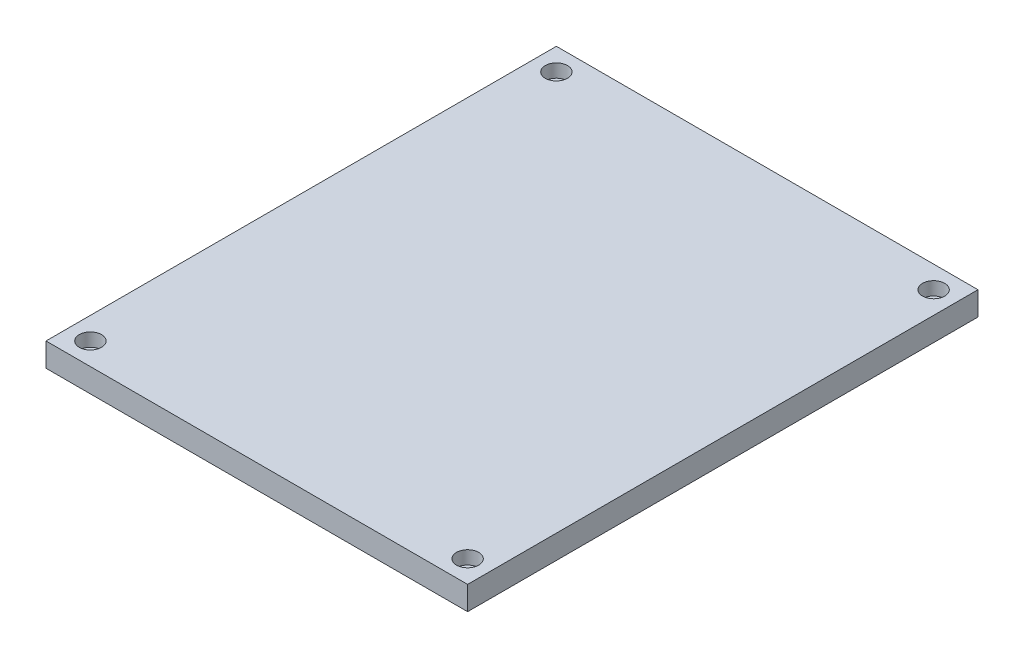
ISO-10303-21;
HEADER;
FILE_DESCRIPTION(('STEP AP214'),'2;1');
FILE_NAME('part.step','',(''),(''),'','','');
FILE_SCHEMA(('AUTOMOTIVE_DESIGN { 1 0 10303 214 1 1 1 1 }'));
ENDSEC;
DATA;
#1=APPLICATION_CONTEXT('core data for automotive mechanical design processes');
#2=APPLICATION_PROTOCOL_DEFINITION('international standard','automotive_design',2000,#1);
#3=PRODUCT_CONTEXT('',#1,'mechanical');
#4=PRODUCT('Part','Part','',(#3));
#5=PRODUCT_RELATED_PRODUCT_CATEGORY('part','',(#4));
#6=PRODUCT_DEFINITION_FORMATION('','',#4);
#7=PRODUCT_DEFINITION_CONTEXT('part definition',#1,'design');
#8=PRODUCT_DEFINITION('design','',#6,#7);
#9=PRODUCT_DEFINITION_SHAPE('','',#8);
#10=(LENGTH_UNIT() NAMED_UNIT(*) SI_UNIT(.MILLI.,.METRE.));
#11=(NAMED_UNIT(*) PLANE_ANGLE_UNIT() SI_UNIT($,.RADIAN.));
#12=(NAMED_UNIT(*) SI_UNIT($,.STERADIAN.) SOLID_ANGLE_UNIT());
#13=UNCERTAINTY_MEASURE_WITH_UNIT(LENGTH_MEASURE(1.E-05),#10,'distance_accuracy_value','');
#14=(GEOMETRIC_REPRESENTATION_CONTEXT(3) GLOBAL_UNCERTAINTY_ASSIGNED_CONTEXT((#13)) GLOBAL_UNIT_ASSIGNED_CONTEXT((#10,
#11,#12)) REPRESENTATION_CONTEXT('',''));
#15=CARTESIAN_POINT('',(0.,0.,0.));
#16=DIRECTION('',(0.,0.,1.));
#17=DIRECTION('',(1.,0.,0.));
#18=AXIS2_PLACEMENT_3D('',#15,#16,#17);
#19=CARTESIAN_POINT('',(7.50000000000001,-4.,-165.));
#20=DIRECTION('',(0.,1.,0.));
#21=DIRECTION('',(0.,0.,1.));
#22=AXIS2_PLACEMENT_3D('',#19,#20,#21);
#23=CYLINDRICAL_SURFACE('',#22,2.25000000000001);
#24=CARTESIAN_POINT('',(7.50000000000001,-4.,-165.));
#25=DIRECTION('',(0.,1.,0.));
#26=DIRECTION('',(0.,0.,1.));
#27=AXIS2_PLACEMENT_3D('',#24,#25,#26);
#28=CIRCLE('',#27,2.25000000000001);
#29=CARTESIAN_POINT('',(7.50000000000001,-4.,-162.75));
#30=VERTEX_POINT('',#29);
#31=EDGE_CURVE('E106',#30,#30,#28,.T.);
#32=ORIENTED_EDGE('',*,*,#31,.F.);
#33=EDGE_LOOP('',(#32));
#34=FACE_BOUND('',#33,.T.);
#35=CARTESIAN_POINT('',(7.50000000000001,-0.5,-165.));
#36=DIRECTION('',(0.,1.,0.));
#37=DIRECTION('',(0.,0.,1.));
#38=AXIS2_PLACEMENT_3D('',#35,#36,#37);
#39=CIRCLE('',#38,2.25000000000001);
#40=CARTESIAN_POINT('',(7.50000000000001,-0.5,-162.75));
#41=VERTEX_POINT('',#40);
#42=EDGE_CURVE('E122',#41,#41,#39,.F.);
#43=ORIENTED_EDGE('',*,*,#42,.F.);
#44=EDGE_LOOP('',(#43));
#45=FACE_BOUND('',#44,.T.);
#46=ADVANCED_FACE('F36',(#34,#45),#23,.F.);
#47=CARTESIAN_POINT('',(135.,-4.,-165.));
#48=DIRECTION('',(0.,1.,0.));
#49=DIRECTION('',(0.,0.,1.));
#50=AXIS2_PLACEMENT_3D('',#47,#48,#49);
#51=CYLINDRICAL_SURFACE('',#50,2.25000000000001);
#52=CARTESIAN_POINT('',(135.,-4.,-165.));
#53=DIRECTION('',(0.,1.,0.));
#54=DIRECTION('',(0.,0.,1.));
#55=AXIS2_PLACEMENT_3D('',#52,#53,#54);
#56=CIRCLE('',#55,2.25000000000001);
#57=CARTESIAN_POINT('',(135.,-4.,-162.75));
#58=VERTEX_POINT('',#57);
#59=EDGE_CURVE('E144',#58,#58,#56,.T.);
#60=ORIENTED_EDGE('',*,*,#59,.F.);
#61=EDGE_LOOP('',(#60));
#62=FACE_BOUND('',#61,.T.);
#63=CARTESIAN_POINT('',(135.,-0.5,-165.));
#64=DIRECTION('',(0.,1.,0.));
#65=DIRECTION('',(0.,0.,1.));
#66=AXIS2_PLACEMENT_3D('',#63,#64,#65);
#67=CIRCLE('',#66,2.25000000000001);
#68=CARTESIAN_POINT('',(135.,-0.5,-162.75));
#69=VERTEX_POINT('',#68);
#70=EDGE_CURVE('E119',#69,#69,#67,.F.);
#71=ORIENTED_EDGE('',*,*,#70,.F.);
#72=EDGE_LOOP('',(#71));
#73=FACE_BOUND('',#72,.T.);
#74=ADVANCED_FACE('F200',(#62,#73),#51,.F.);
#75=CARTESIAN_POINT('',(135.,-4.,-7.5));
#76=DIRECTION('',(0.,1.,0.));
#77=DIRECTION('',(0.,0.,1.));
#78=AXIS2_PLACEMENT_3D('',#75,#76,#77);
#79=CYLINDRICAL_SURFACE('',#78,2.25000000000001);
#80=CARTESIAN_POINT('',(135.,-4.,-7.5));
#81=DIRECTION('',(0.,1.,0.));
#82=DIRECTION('',(0.,0.,1.));
#83=AXIS2_PLACEMENT_3D('',#80,#81,#82);
#84=CIRCLE('',#83,2.25000000000001);
#85=CARTESIAN_POINT('',(135.,-4.,-5.24999999999999));
#86=VERTEX_POINT('',#85);
#87=EDGE_CURVE('E139',#86,#86,#84,.T.);
#88=ORIENTED_EDGE('',*,*,#87,.F.);
#89=EDGE_LOOP('',(#88));
#90=FACE_BOUND('',#89,.T.);
#91=CARTESIAN_POINT('',(135.,-0.5,-7.5));
#92=DIRECTION('',(0.,1.,0.));
#93=DIRECTION('',(0.,0.,1.));
#94=AXIS2_PLACEMENT_3D('',#91,#92,#93);
#95=CIRCLE('',#94,2.25000000000001);
#96=CARTESIAN_POINT('',(135.,-0.5,-5.24999999999999));
#97=VERTEX_POINT('',#96);
#98=EDGE_CURVE('E115',#97,#97,#95,.F.);
#99=ORIENTED_EDGE('',*,*,#98,.F.);
#100=EDGE_LOOP('',(#99));
#101=FACE_BOUND('',#100,.T.);
#102=ADVANCED_FACE('F206',(#90,#101),#79,.F.);
#103=CARTESIAN_POINT('',(7.50000000000001,-4.,-7.5));
#104=DIRECTION('',(0.,1.,0.));
#105=DIRECTION('',(0.,0.,1.));
#106=AXIS2_PLACEMENT_3D('',#103,#104,#105);
#107=CYLINDRICAL_SURFACE('',#106,2.25);
#108=CARTESIAN_POINT('',(7.50000000000001,-4.,-7.5));
#109=DIRECTION('',(0.,1.,0.));
#110=DIRECTION('',(0.,0.,1.));
#111=AXIS2_PLACEMENT_3D('',#108,#109,#110);
#112=CIRCLE('',#111,2.25);
#113=CARTESIAN_POINT('',(7.50000000000001,-4.,-5.25));
#114=VERTEX_POINT('',#113);
#115=EDGE_CURVE('E135',#114,#114,#112,.T.);
#116=ORIENTED_EDGE('',*,*,#115,.F.);
#117=EDGE_LOOP('',(#116));
#118=FACE_BOUND('',#117,.T.);
#119=CARTESIAN_POINT('',(7.50000000000001,-0.5,-7.5));
#120=DIRECTION('',(0.,1.,0.));
#121=DIRECTION('',(0.,0.,1.));
#122=AXIS2_PLACEMENT_3D('',#119,#120,#121);
#123=CIRCLE('',#122,2.25);
#124=CARTESIAN_POINT('',(7.50000000000001,-0.5,-5.25));
#125=VERTEX_POINT('',#124);
#126=EDGE_CURVE('E112',#125,#125,#123,.F.);
#127=ORIENTED_EDGE('',*,*,#126,.F.);
#128=EDGE_LOOP('',(#127));
#129=FACE_BOUND('',#128,.T.);
#130=ADVANCED_FACE('F210',(#118,#129),#107,.F.);
#131=CARTESIAN_POINT('',(142.5,4.,0.));
#132=DIRECTION('',(0.,0.,-1.));
#133=DIRECTION('',(-1.,0.,0.));
#134=AXIS2_PLACEMENT_3D('',#131,#132,#133);
#135=PLANE('',#134);
#136=DIRECTION('',(1.,0.,0.));
#137=VECTOR('',#136,1.);
#138=CARTESIAN_POINT('',(142.5,-4.,0.));
#139=LINE('',#138,#137);
#140=CARTESIAN_POINT('',(0.,-4.,0.));
#141=VERTEX_POINT('',#140);
#142=CARTESIAN_POINT('',(142.5,-4.,0.));
#143=VERTEX_POINT('',#142);
#144=EDGE_CURVE('E103',#141,#143,#139,.T.);
#145=ORIENTED_EDGE('',*,*,#144,.T.);
#146=DIRECTION('',(0.,-1.,0.));
#147=VECTOR('',#146,1.);
#148=CARTESIAN_POINT('',(142.5,4.,0.));
#149=LINE('',#148,#147);
#150=CARTESIAN_POINT('',(142.5,4.,0.));
#151=VERTEX_POINT('',#150);
#152=EDGE_CURVE('E11',#151,#143,#149,.T.);
#153=ORIENTED_EDGE('',*,*,#152,.F.);
#154=DIRECTION('',(1.,0.,0.));
#155=VECTOR('',#154,1.);
#156=CARTESIAN_POINT('',(142.5,4.,0.));
#157=LINE('',#156,#155);
#158=CARTESIAN_POINT('',(0.,4.,0.));
#159=VERTEX_POINT('',#158);
#160=EDGE_CURVE('E90',#159,#151,#157,.T.);
#161=ORIENTED_EDGE('',*,*,#160,.F.);
#162=DIRECTION('',(0.,-1.,0.));
#163=VECTOR('',#162,1.);
#164=CARTESIAN_POINT('',(0.,4.,0.));
#165=LINE('',#164,#163);
#166=EDGE_CURVE('E99',#159,#141,#165,.T.);
#167=ORIENTED_EDGE('',*,*,#166,.T.);
#168=EDGE_LOOP('',(#145,#153,#161,#167));
#169=FACE_BOUND('',#168,.T.);
#170=ADVANCED_FACE('F38',(#169),#135,.F.);
#171=CARTESIAN_POINT('',(142.5,4.,-172.5));
#172=DIRECTION('',(-1.,0.,0.));
#173=DIRECTION('',(0.,0.,1.));
#174=AXIS2_PLACEMENT_3D('',#171,#172,#173);
#175=PLANE('',#174);
#176=DIRECTION('',(0.,0.,-1.));
#177=VECTOR('',#176,1.);
#178=CARTESIAN_POINT('',(142.5,-4.,-172.5));
#179=LINE('',#178,#177);
#180=CARTESIAN_POINT('',(142.5,-4.,-172.5));
#181=VERTEX_POINT('',#180);
#182=EDGE_CURVE('E94',#143,#181,#179,.T.);
#183=ORIENTED_EDGE('',*,*,#182,.T.);
#184=DIRECTION('',(0.,-1.,0.));
#185=VECTOR('',#184,1.);
#186=CARTESIAN_POINT('',(142.5,4.,-172.5));
#187=LINE('',#186,#185);
#188=CARTESIAN_POINT('',(142.5,4.,-172.5));
#189=VERTEX_POINT('',#188);
#190=EDGE_CURVE('E46',#189,#181,#187,.T.);
#191=ORIENTED_EDGE('',*,*,#190,.F.);
#192=DIRECTION('',(0.,0.,-1.));
#193=VECTOR('',#192,1.);
#194=CARTESIAN_POINT('',(142.5,4.,-172.5));
#195=LINE('',#194,#193);
#196=EDGE_CURVE('E85',#151,#189,#195,.T.);
#197=ORIENTED_EDGE('',*,*,#196,.F.);
#198=ORIENTED_EDGE('',*,*,#152,.T.);
#199=EDGE_LOOP('',(#183,#191,#197,#198));
#200=FACE_BOUND('',#199,.T.);
#201=ADVANCED_FACE('F93',(#200),#175,.F.);
#202=CARTESIAN_POINT('',(0.,4.,-172.5));
#203=DIRECTION('',(0.,0.,1.));
#204=DIRECTION('',(1.,0.,0.));
#205=AXIS2_PLACEMENT_3D('',#202,#203,#204);
#206=PLANE('',#205);
#207=DIRECTION('',(-1.,0.,0.));
#208=VECTOR('',#207,1.);
#209=CARTESIAN_POINT('',(0.,-4.,-172.5));
#210=LINE('',#209,#208);
#211=CARTESIAN_POINT('',(0.,-4.,-172.5));
#212=VERTEX_POINT('',#211);
#213=EDGE_CURVE('E72',#181,#212,#210,.T.);
#214=ORIENTED_EDGE('',*,*,#213,.T.);
#215=DIRECTION('',(0.,-1.,0.));
#216=VECTOR('',#215,1.);
#217=CARTESIAN_POINT('',(0.,4.,-172.5));
#218=LINE('',#217,#216);
#219=CARTESIAN_POINT('',(0.,4.,-172.5));
#220=VERTEX_POINT('',#219);
#221=EDGE_CURVE('E95',#220,#212,#218,.T.);
#222=ORIENTED_EDGE('',*,*,#221,.F.);
#223=DIRECTION('',(-1.,0.,0.));
#224=VECTOR('',#223,1.);
#225=CARTESIAN_POINT('',(0.,4.,-172.5));
#226=LINE('',#225,#224);
#227=EDGE_CURVE('E88',#189,#220,#226,.T.);
#228=ORIENTED_EDGE('',*,*,#227,.F.);
#229=ORIENTED_EDGE('',*,*,#190,.T.);
#230=EDGE_LOOP('',(#214,#222,#228,#229));
#231=FACE_BOUND('',#230,.T.);
#232=ADVANCED_FACE('F97',(#231),#206,.F.);
#233=CARTESIAN_POINT('',(0.,4.,0.));
#234=DIRECTION('',(1.,0.,0.));
#235=DIRECTION('',(0.,0.,-1.));
#236=AXIS2_PLACEMENT_3D('',#233,#234,#235);
#237=PLANE('',#236);
#238=DIRECTION('',(0.,0.,1.));
#239=VECTOR('',#238,1.);
#240=CARTESIAN_POINT('',(0.,-4.,0.));
#241=LINE('',#240,#239);
#242=EDGE_CURVE('E78',#212,#141,#241,.T.);
#243=ORIENTED_EDGE('',*,*,#242,.T.);
#244=ORIENTED_EDGE('',*,*,#166,.F.);
#245=DIRECTION('',(0.,0.,1.));
#246=VECTOR('',#245,1.);
#247=CARTESIAN_POINT('',(0.,4.,0.));
#248=LINE('',#247,#246);
#249=EDGE_CURVE('E55',#220,#159,#248,.T.);
#250=ORIENTED_EDGE('',*,*,#249,.F.);
#251=ORIENTED_EDGE('',*,*,#221,.T.);
#252=EDGE_LOOP('',(#243,#244,#250,#251));
#253=FACE_BOUND('',#252,.T.);
#254=ADVANCED_FACE('F180',(#253),#237,.F.);
#255=CARTESIAN_POINT('',(0.,4.,0.));
#256=DIRECTION('',(0.,-1.,0.));
#257=DIRECTION('',(0.,0.,-1.));
#258=AXIS2_PLACEMENT_3D('',#255,#256,#257);
#259=PLANE('',#258);
#260=CARTESIAN_POINT('',(7.50000000000001,4.,-7.5));
#261=DIRECTION('',(0.,-1.,0.));
#262=DIRECTION('',(0.,0.,-1.));
#263=AXIS2_PLACEMENT_3D('',#260,#261,#262);
#264=CIRCLE('',#263,3.75);
#265=CARTESIAN_POINT('',(7.50000000000001,4.,-11.25));
#266=VERTEX_POINT('',#265);
#267=EDGE_CURVE('E40',#266,#266,#264,.F.);
#268=ORIENTED_EDGE('',*,*,#267,.F.);
#269=EDGE_LOOP('',(#268));
#270=FACE_BOUND('',#269,.T.);
#271=CARTESIAN_POINT('',(135.,4.,-7.5));
#272=DIRECTION('',(0.,-1.,0.));
#273=DIRECTION('',(0.,0.,-1.));
#274=AXIS2_PLACEMENT_3D('',#271,#272,#273);
#275=CIRCLE('',#274,3.75000000000001);
#276=CARTESIAN_POINT('',(135.,4.,-11.25));
#277=VERTEX_POINT('',#276);
#278=EDGE_CURVE('E130',#277,#277,#275,.F.);
#279=ORIENTED_EDGE('',*,*,#278,.F.);
#280=EDGE_LOOP('',(#279));
#281=FACE_BOUND('',#280,.T.);
#282=CARTESIAN_POINT('',(135.,4.,-165.));
#283=DIRECTION('',(0.,-1.,0.));
#284=DIRECTION('',(0.,0.,-1.));
#285=AXIS2_PLACEMENT_3D('',#282,#283,#284);
#286=CIRCLE('',#285,3.75000000000001);
#287=CARTESIAN_POINT('',(135.,4.,-168.75));
#288=VERTEX_POINT('',#287);
#289=EDGE_CURVE('E128',#288,#288,#286,.F.);
#290=ORIENTED_EDGE('',*,*,#289,.F.);
#291=EDGE_LOOP('',(#290));
#292=FACE_BOUND('',#291,.T.);
#293=CARTESIAN_POINT('',(7.50000000000001,4.,-165.));
#294=DIRECTION('',(0.,-1.,0.));
#295=DIRECTION('',(0.,0.,-1.));
#296=AXIS2_PLACEMENT_3D('',#293,#294,#295);
#297=CIRCLE('',#296,3.75);
#298=CARTESIAN_POINT('',(7.50000000000001,4.,-168.75));
#299=VERTEX_POINT('',#298);
#300=EDGE_CURVE('E125',#299,#299,#297,.F.);
#301=ORIENTED_EDGE('',*,*,#300,.F.);
#302=EDGE_LOOP('',(#301));
#303=FACE_BOUND('',#302,.T.);
#304=ORIENTED_EDGE('',*,*,#160,.T.);
#305=ORIENTED_EDGE('',*,*,#196,.T.);
#306=ORIENTED_EDGE('',*,*,#227,.T.);
#307=ORIENTED_EDGE('',*,*,#249,.T.);
#308=EDGE_LOOP('',(#304,#305,#306,#307));
#309=FACE_BOUND('',#308,.T.);
#310=ADVANCED_FACE('F86',(#270,#281,#292,#303,#309),#259,.F.);
#311=CARTESIAN_POINT('',(0.,-4.,0.));
#312=DIRECTION('',(0.,-1.,0.));
#313=DIRECTION('',(0.,0.,-1.));
#314=AXIS2_PLACEMENT_3D('',#311,#312,#313);
#315=PLANE('',#314);
#316=ORIENTED_EDGE('',*,*,#115,.T.);
#317=EDGE_LOOP('',(#316));
#318=FACE_BOUND('',#317,.T.);
#319=ORIENTED_EDGE('',*,*,#87,.T.);
#320=EDGE_LOOP('',(#319));
#321=FACE_BOUND('',#320,.T.);
#322=ORIENTED_EDGE('',*,*,#59,.T.);
#323=EDGE_LOOP('',(#322));
#324=FACE_BOUND('',#323,.T.);
#325=ORIENTED_EDGE('',*,*,#31,.T.);
#326=EDGE_LOOP('',(#325));
#327=FACE_BOUND('',#326,.T.);
#328=ORIENTED_EDGE('',*,*,#144,.F.);
#329=ORIENTED_EDGE('',*,*,#242,.F.);
#330=ORIENTED_EDGE('',*,*,#213,.F.);
#331=ORIENTED_EDGE('',*,*,#182,.F.);
#332=EDGE_LOOP('',(#328,#329,#330,#331));
#333=FACE_BOUND('',#332,.T.);
#334=ADVANCED_FACE('F179',(#318,#321,#324,#327,#333),#315,.T.);
#335=CARTESIAN_POINT('',(7.50000000000001,4.000012,-7.5));
#336=DIRECTION('',(0.,-1.,0.));
#337=DIRECTION('',(0.,0.,-1.));
#338=AXIS2_PLACEMENT_3D('',#335,#336,#337);
#339=CYLINDRICAL_SURFACE('',#338,3.75);
#340=CARTESIAN_POINT('',(7.50000000000001,-0.5,-7.5));
#341=DIRECTION('',(0.,1.,0.));
#342=DIRECTION('',(0.,0.,1.));
#343=AXIS2_PLACEMENT_3D('',#340,#341,#342);
#344=CIRCLE('',#343,3.75);
#345=CARTESIAN_POINT('',(7.50000000000001,-0.5,-11.25));
#346=VERTEX_POINT('',#345);
#347=EDGE_CURVE('E158',#346,#346,#344,.T.);
#348=CARTESIAN_POINT('',(7.50000000000001,-0.5,-11.25));
#349=CARTESIAN_POINT('',(7.50000000000001,-0.453125,-11.25));
#350=CARTESIAN_POINT('',(7.50000000000001,-0.40625,-11.25));
#351=CARTESIAN_POINT('',(7.50000000000001,-0.3125,-11.25));
#352=CARTESIAN_POINT('',(7.50000000000001,-0.265625,-11.25));
#353=CARTESIAN_POINT('',(7.50000000000001,-0.171875,-11.25));
#354=CARTESIAN_POINT('',(7.50000000000001,-0.125,-11.25));
#355=CARTESIAN_POINT('',(7.50000000000001,-0.03125,-11.25));
#356=CARTESIAN_POINT('',(7.50000000000001,0.015625,-11.25));
#357=CARTESIAN_POINT('',(7.50000000000001,0.109375,-11.25));
#358=CARTESIAN_POINT('',(7.50000000000001,0.15625,-11.25));
#359=CARTESIAN_POINT('',(7.50000000000001,0.25,-11.25));
#360=CARTESIAN_POINT('',(7.50000000000001,0.296875,-11.25));
#361=CARTESIAN_POINT('',(7.50000000000001,0.390625,-11.25));
#362=CARTESIAN_POINT('',(7.50000000000001,0.4375,-11.25));
#363=CARTESIAN_POINT('',(7.50000000000001,0.53125,-11.25));
#364=CARTESIAN_POINT('',(7.50000000000001,0.578125,-11.25));
#365=CARTESIAN_POINT('',(7.50000000000001,0.671875,-11.25));
#366=CARTESIAN_POINT('',(7.50000000000001,0.71875,-11.25));
#367=CARTESIAN_POINT('',(7.50000000000001,0.8125,-11.25));
#368=CARTESIAN_POINT('',(7.50000000000001,0.859375,-11.25));
#369=CARTESIAN_POINT('',(7.50000000000001,0.953125,-11.25));
#370=CARTESIAN_POINT('',(7.50000000000001,1.,-11.25));
#371=CARTESIAN_POINT('',(7.50000000000001,1.09375,-11.25));
#372=CARTESIAN_POINT('',(7.50000000000001,1.140625,-11.25));
#373=CARTESIAN_POINT('',(7.50000000000001,1.234375,-11.25));
#374=CARTESIAN_POINT('',(7.50000000000001,1.28125,-11.25));
#375=CARTESIAN_POINT('',(7.50000000000001,1.375,-11.25));
#376=CARTESIAN_POINT('',(7.50000000000001,1.421875,-11.25));
#377=CARTESIAN_POINT('',(7.50000000000001,1.515625,-11.25));
#378=CARTESIAN_POINT('',(7.50000000000001,1.5625,-11.25));
#379=CARTESIAN_POINT('',(7.50000000000001,1.65625,-11.25));
#380=CARTESIAN_POINT('',(7.50000000000001,1.703125,-11.25));
#381=CARTESIAN_POINT('',(7.50000000000001,1.796875,-11.25));
#382=CARTESIAN_POINT('',(7.50000000000001,1.84375,-11.25));
#383=CARTESIAN_POINT('',(7.50000000000001,1.9375,-11.25));
#384=CARTESIAN_POINT('',(7.50000000000001,1.984375,-11.25));
#385=CARTESIAN_POINT('',(7.50000000000001,2.078125,-11.25));
#386=CARTESIAN_POINT('',(7.50000000000001,2.125,-11.25));
#387=CARTESIAN_POINT('',(7.50000000000001,2.21875,-11.25));
#388=CARTESIAN_POINT('',(7.50000000000001,2.265625,-11.25));
#389=CARTESIAN_POINT('',(7.50000000000001,2.359375,-11.25));
#390=CARTESIAN_POINT('',(7.50000000000001,2.40625,-11.25));
#391=CARTESIAN_POINT('',(7.50000000000001,2.5,-11.25));
#392=CARTESIAN_POINT('',(7.50000000000001,2.546875,-11.25));
#393=CARTESIAN_POINT('',(7.50000000000001,2.640625,-11.25));
#394=CARTESIAN_POINT('',(7.50000000000001,2.6875,-11.25));
#395=CARTESIAN_POINT('',(7.50000000000001,2.78125,-11.25));
#396=CARTESIAN_POINT('',(7.50000000000001,2.828125,-11.25));
#397=CARTESIAN_POINT('',(7.50000000000001,2.921875,-11.25));
#398=CARTESIAN_POINT('',(7.50000000000001,2.96875,-11.25));
#399=CARTESIAN_POINT('',(7.50000000000001,3.0625,-11.25));
#400=CARTESIAN_POINT('',(7.50000000000001,3.109375,-11.25));
#401=CARTESIAN_POINT('',(7.50000000000001,3.203125,-11.25));
#402=CARTESIAN_POINT('',(7.50000000000001,3.25,-11.25));
#403=CARTESIAN_POINT('',(7.50000000000001,3.34375,-11.25));
#404=CARTESIAN_POINT('',(7.50000000000001,3.390625,-11.25));
#405=CARTESIAN_POINT('',(7.50000000000001,3.484375,-11.25));
#406=CARTESIAN_POINT('',(7.50000000000001,3.53125,-11.25));
#407=CARTESIAN_POINT('',(7.50000000000001,3.625,-11.25));
#408=CARTESIAN_POINT('',(7.50000000000001,3.671875,-11.25));
#409=CARTESIAN_POINT('',(7.50000000000001,3.765625,-11.25));
#410=CARTESIAN_POINT('',(7.50000000000001,3.8125,-11.25));
#411=CARTESIAN_POINT('',(7.50000000000001,3.90625,-11.25));
#412=CARTESIAN_POINT('',(7.50000000000001,3.953125,-11.25));
#413=CARTESIAN_POINT('',(7.50000000000001,4.,-11.25));
#414=B_SPLINE_CURVE_WITH_KNOTS('',3,(#348,#349,#350,#351,#352,#353,#354,#355,#356,#357,#358,
#359,#360,#361,#362,#363,#364,#365,#366,#367,#368,#369,#370,#371,#372,#373,#374,#375,#376,#377,
#378,#379,#380,#381,#382,#383,#384,#385,#386,#387,#388,#389,#390,#391,#392,#393,#394,#395,#396,
#397,#398,#399,#400,#401,#402,#403,#404,#405,#406,#407,#408,#409,#410,#411,#412,#413),
.UNSPECIFIED.,.F.,.F.,(4,2,2,2,2,2,2,2,2,2,2,2,2,2,2,2,2,2,2,2,2,2,2,2,2,2,2,2,2,2,2,2,4),(0.,
0.140625,0.28125,0.421875,0.5625,0.703125,0.84375,0.984375,1.125,1.265625,1.40625,1.546875,
1.6875,1.828125,1.96875,2.109375,2.25,2.390625,2.53125,2.671875,2.8125,2.953125,3.09375,
3.234375,3.375,3.515625,3.65625,3.796875,3.9375,4.078125,4.21875,4.359375,4.5),.UNSPECIFIED.);
#415=EDGE_CURVE('BSEAM215',#346,#266,#414,.T.);
#416=ORIENTED_EDGE('',*,*,#347,.F.);
#417=ORIENTED_EDGE('',*,*,#267,.T.);
#418=ORIENTED_EDGE('',*,*,#415,.T.);
#419=ORIENTED_EDGE('',*,*,#415,.F.);
#420=EDGE_LOOP('',(#416,#418,#417,#419));
#421=FACE_BOUND('',#420,.T.);
#422=ADVANCED_FACE('F215',(#421),#339,.F.);
#423=CARTESIAN_POINT('',(7.50000000000001,-0.5,-7.5));
#424=DIRECTION('',(0.,1.,0.));
#425=DIRECTION('',(0.,0.,1.));
#426=AXIS2_PLACEMENT_3D('',#423,#424,#425);
#427=PLANE('',#426);
#428=ORIENTED_EDGE('',*,*,#347,.T.);
#429=EDGE_LOOP('',(#428));
#430=FACE_BOUND('',#429,.T.);
#431=ORIENTED_EDGE('',*,*,#126,.T.);
#432=EDGE_LOOP('',(#431));
#433=FACE_BOUND('',#432,.T.);
#434=ADVANCED_FACE('F237',(#430,#433),#427,.T.);
#435=CARTESIAN_POINT('',(135.,4.000012,-7.5));
#436=DIRECTION('',(0.,-1.,0.));
#437=DIRECTION('',(0.,0.,-1.));
#438=AXIS2_PLACEMENT_3D('',#435,#436,#437);
#439=CYLINDRICAL_SURFACE('',#438,3.75000000000001);
#440=CARTESIAN_POINT('',(135.,-0.5,-7.5));
#441=DIRECTION('',(0.,1.,0.));
#442=DIRECTION('',(0.,0.,1.));
#443=AXIS2_PLACEMENT_3D('',#440,#441,#442);
#444=CIRCLE('',#443,3.75000000000001);
#445=CARTESIAN_POINT('',(135.,-0.5,-11.25));
#446=VERTEX_POINT('',#445);
#447=EDGE_CURVE('E161',#446,#446,#444,.T.);
#448=CARTESIAN_POINT('',(135.,-0.5,-11.25));
#449=CARTESIAN_POINT('',(135.,-0.453125,-11.25));
#450=CARTESIAN_POINT('',(135.,-0.40625,-11.25));
#451=CARTESIAN_POINT('',(135.,-0.3125,-11.25));
#452=CARTESIAN_POINT('',(135.,-0.265625,-11.25));
#453=CARTESIAN_POINT('',(135.,-0.171875,-11.25));
#454=CARTESIAN_POINT('',(135.,-0.125,-11.25));
#455=CARTESIAN_POINT('',(135.,-0.03125,-11.25));
#456=CARTESIAN_POINT('',(135.,0.015625,-11.25));
#457=CARTESIAN_POINT('',(135.,0.109375,-11.25));
#458=CARTESIAN_POINT('',(135.,0.15625,-11.25));
#459=CARTESIAN_POINT('',(135.,0.25,-11.25));
#460=CARTESIAN_POINT('',(135.,0.296875,-11.25));
#461=CARTESIAN_POINT('',(135.,0.390625,-11.25));
#462=CARTESIAN_POINT('',(135.,0.4375,-11.25));
#463=CARTESIAN_POINT('',(135.,0.53125,-11.25));
#464=CARTESIAN_POINT('',(135.,0.578125,-11.25));
#465=CARTESIAN_POINT('',(135.,0.671875,-11.25));
#466=CARTESIAN_POINT('',(135.,0.71875,-11.25));
#467=CARTESIAN_POINT('',(135.,0.8125,-11.25));
#468=CARTESIAN_POINT('',(135.,0.859375,-11.25));
#469=CARTESIAN_POINT('',(135.,0.953125,-11.25));
#470=CARTESIAN_POINT('',(135.,1.,-11.25));
#471=CARTESIAN_POINT('',(135.,1.09375,-11.25));
#472=CARTESIAN_POINT('',(135.,1.140625,-11.25));
#473=CARTESIAN_POINT('',(135.,1.234375,-11.25));
#474=CARTESIAN_POINT('',(135.,1.28125,-11.25));
#475=CARTESIAN_POINT('',(135.,1.375,-11.25));
#476=CARTESIAN_POINT('',(135.,1.421875,-11.25));
#477=CARTESIAN_POINT('',(135.,1.515625,-11.25));
#478=CARTESIAN_POINT('',(135.,1.5625,-11.25));
#479=CARTESIAN_POINT('',(135.,1.65625,-11.25));
#480=CARTESIAN_POINT('',(135.,1.703125,-11.25));
#481=CARTESIAN_POINT('',(135.,1.796875,-11.25));
#482=CARTESIAN_POINT('',(135.,1.84375,-11.25));
#483=CARTESIAN_POINT('',(135.,1.9375,-11.25));
#484=CARTESIAN_POINT('',(135.,1.984375,-11.25));
#485=CARTESIAN_POINT('',(135.,2.078125,-11.25));
#486=CARTESIAN_POINT('',(135.,2.125,-11.25));
#487=CARTESIAN_POINT('',(135.,2.21875,-11.25));
#488=CARTESIAN_POINT('',(135.,2.265625,-11.25));
#489=CARTESIAN_POINT('',(135.,2.359375,-11.25));
#490=CARTESIAN_POINT('',(135.,2.40625,-11.25));
#491=CARTESIAN_POINT('',(135.,2.5,-11.25));
#492=CARTESIAN_POINT('',(135.,2.546875,-11.25));
#493=CARTESIAN_POINT('',(135.,2.640625,-11.25));
#494=CARTESIAN_POINT('',(135.,2.6875,-11.25));
#495=CARTESIAN_POINT('',(135.,2.78125,-11.25));
#496=CARTESIAN_POINT('',(135.,2.828125,-11.25));
#497=CARTESIAN_POINT('',(135.,2.921875,-11.25));
#498=CARTESIAN_POINT('',(135.,2.96875,-11.25));
#499=CARTESIAN_POINT('',(135.,3.0625,-11.25));
#500=CARTESIAN_POINT('',(135.,3.109375,-11.25));
#501=CARTESIAN_POINT('',(135.,3.203125,-11.25));
#502=CARTESIAN_POINT('',(135.,3.25,-11.25));
#503=CARTESIAN_POINT('',(135.,3.34375,-11.25));
#504=CARTESIAN_POINT('',(135.,3.390625,-11.25));
#505=CARTESIAN_POINT('',(135.,3.484375,-11.25));
#506=CARTESIAN_POINT('',(135.,3.53125,-11.25));
#507=CARTESIAN_POINT('',(135.,3.625,-11.25));
#508=CARTESIAN_POINT('',(135.,3.671875,-11.25));
#509=CARTESIAN_POINT('',(135.,3.765625,-11.25));
#510=CARTESIAN_POINT('',(135.,3.8125,-11.25));
#511=CARTESIAN_POINT('',(135.,3.90625,-11.25));
#512=CARTESIAN_POINT('',(135.,3.953125,-11.25));
#513=CARTESIAN_POINT('',(135.,4.,-11.25));
#514=B_SPLINE_CURVE_WITH_KNOTS('',3,(#448,#449,#450,#451,#452,#453,#454,#455,#456,#457,#458,
#459,#460,#461,#462,#463,#464,#465,#466,#467,#468,#469,#470,#471,#472,#473,#474,#475,#476,#477,
#478,#479,#480,#481,#482,#483,#484,#485,#486,#487,#488,#489,#490,#491,#492,#493,#494,#495,#496,
#497,#498,#499,#500,#501,#502,#503,#504,#505,#506,#507,#508,#509,#510,#511,#512,#513),
.UNSPECIFIED.,.F.,.F.,(4,2,2,2,2,2,2,2,2,2,2,2,2,2,2,2,2,2,2,2,2,2,2,2,2,2,2,2,2,2,2,2,4),(0.,
0.140625,0.28125,0.421875,0.5625,0.703125,0.84375,0.984375,1.125,1.265625,1.40625,1.546875,
1.6875,1.828125,1.96875,2.109375,2.25,2.390625,2.53125,2.671875,2.8125,2.953125,3.09375,
3.234375,3.375,3.515625,3.65625,3.796875,3.9375,4.078125,4.21875,4.359375,4.5),.UNSPECIFIED.);
#515=EDGE_CURVE('BSEAM239',#446,#277,#514,.T.);
#516=ORIENTED_EDGE('',*,*,#447,.F.);
#517=ORIENTED_EDGE('',*,*,#278,.T.);
#518=ORIENTED_EDGE('',*,*,#515,.T.);
#519=ORIENTED_EDGE('',*,*,#515,.F.);
#520=EDGE_LOOP('',(#516,#518,#517,#519));
#521=FACE_BOUND('',#520,.T.);
#522=ADVANCED_FACE('F239',(#521),#439,.F.);
#523=CARTESIAN_POINT('',(135.,-0.5,-7.5));
#524=DIRECTION('',(0.,1.,0.));
#525=DIRECTION('',(0.,0.,1.));
#526=AXIS2_PLACEMENT_3D('',#523,#524,#525);
#527=PLANE('',#526);
#528=ORIENTED_EDGE('',*,*,#447,.T.);
#529=EDGE_LOOP('',(#528));
#530=FACE_BOUND('',#529,.T.);
#531=ORIENTED_EDGE('',*,*,#98,.T.);
#532=EDGE_LOOP('',(#531));
#533=FACE_BOUND('',#532,.T.);
#534=ADVANCED_FACE('F173',(#530,#533),#527,.T.);
#535=CARTESIAN_POINT('',(135.,4.000012,-165.));
#536=DIRECTION('',(0.,-1.,0.));
#537=DIRECTION('',(0.,0.,-1.));
#538=AXIS2_PLACEMENT_3D('',#535,#536,#537);
#539=CYLINDRICAL_SURFACE('',#538,3.75000000000001);
#540=CARTESIAN_POINT('',(135.,-0.5,-165.));
#541=DIRECTION('',(0.,1.,0.));
#542=DIRECTION('',(0.,0.,1.));
#543=AXIS2_PLACEMENT_3D('',#540,#541,#542);
#544=CIRCLE('',#543,3.75000000000001);
#545=CARTESIAN_POINT('',(135.,-0.5,-168.75));
#546=VERTEX_POINT('',#545);
#547=EDGE_CURVE('E157',#546,#546,#544,.T.);
#548=CARTESIAN_POINT('',(135.,-0.5,-168.75));
#549=CARTESIAN_POINT('',(135.,-0.453125,-168.75));
#550=CARTESIAN_POINT('',(135.,-0.40625,-168.75));
#551=CARTESIAN_POINT('',(135.,-0.3125,-168.75));
#552=CARTESIAN_POINT('',(135.,-0.265625,-168.75));
#553=CARTESIAN_POINT('',(135.,-0.171875,-168.75));
#554=CARTESIAN_POINT('',(135.,-0.125,-168.75));
#555=CARTESIAN_POINT('',(135.,-0.03125,-168.75));
#556=CARTESIAN_POINT('',(135.,0.015625,-168.75));
#557=CARTESIAN_POINT('',(135.,0.109375,-168.75));
#558=CARTESIAN_POINT('',(135.,0.15625,-168.75));
#559=CARTESIAN_POINT('',(135.,0.25,-168.75));
#560=CARTESIAN_POINT('',(135.,0.296875,-168.75));
#561=CARTESIAN_POINT('',(135.,0.390625,-168.75));
#562=CARTESIAN_POINT('',(135.,0.4375,-168.75));
#563=CARTESIAN_POINT('',(135.,0.53125,-168.75));
#564=CARTESIAN_POINT('',(135.,0.578125,-168.75));
#565=CARTESIAN_POINT('',(135.,0.671875,-168.75));
#566=CARTESIAN_POINT('',(135.,0.71875,-168.75));
#567=CARTESIAN_POINT('',(135.,0.8125,-168.75));
#568=CARTESIAN_POINT('',(135.,0.859375,-168.75));
#569=CARTESIAN_POINT('',(135.,0.953125,-168.75));
#570=CARTESIAN_POINT('',(135.,1.,-168.75));
#571=CARTESIAN_POINT('',(135.,1.09375,-168.75));
#572=CARTESIAN_POINT('',(135.,1.140625,-168.75));
#573=CARTESIAN_POINT('',(135.,1.234375,-168.75));
#574=CARTESIAN_POINT('',(135.,1.28125,-168.75));
#575=CARTESIAN_POINT('',(135.,1.375,-168.75));
#576=CARTESIAN_POINT('',(135.,1.421875,-168.75));
#577=CARTESIAN_POINT('',(135.,1.515625,-168.75));
#578=CARTESIAN_POINT('',(135.,1.5625,-168.75));
#579=CARTESIAN_POINT('',(135.,1.65625,-168.75));
#580=CARTESIAN_POINT('',(135.,1.703125,-168.75));
#581=CARTESIAN_POINT('',(135.,1.796875,-168.75));
#582=CARTESIAN_POINT('',(135.,1.84375,-168.75));
#583=CARTESIAN_POINT('',(135.,1.9375,-168.75));
#584=CARTESIAN_POINT('',(135.,1.984375,-168.75));
#585=CARTESIAN_POINT('',(135.,2.078125,-168.75));
#586=CARTESIAN_POINT('',(135.,2.125,-168.75));
#587=CARTESIAN_POINT('',(135.,2.21875,-168.75));
#588=CARTESIAN_POINT('',(135.,2.265625,-168.75));
#589=CARTESIAN_POINT('',(135.,2.359375,-168.75));
#590=CARTESIAN_POINT('',(135.,2.40625,-168.75));
#591=CARTESIAN_POINT('',(135.,2.5,-168.75));
#592=CARTESIAN_POINT('',(135.,2.546875,-168.75));
#593=CARTESIAN_POINT('',(135.,2.640625,-168.75));
#594=CARTESIAN_POINT('',(135.,2.6875,-168.75));
#595=CARTESIAN_POINT('',(135.,2.78125,-168.75));
#596=CARTESIAN_POINT('',(135.,2.828125,-168.75));
#597=CARTESIAN_POINT('',(135.,2.921875,-168.75));
#598=CARTESIAN_POINT('',(135.,2.96875,-168.75));
#599=CARTESIAN_POINT('',(135.,3.0625,-168.75));
#600=CARTESIAN_POINT('',(135.,3.109375,-168.75));
#601=CARTESIAN_POINT('',(135.,3.203125,-168.75));
#602=CARTESIAN_POINT('',(135.,3.25,-168.75));
#603=CARTESIAN_POINT('',(135.,3.34375,-168.75));
#604=CARTESIAN_POINT('',(135.,3.390625,-168.75));
#605=CARTESIAN_POINT('',(135.,3.484375,-168.75));
#606=CARTESIAN_POINT('',(135.,3.53125,-168.75));
#607=CARTESIAN_POINT('',(135.,3.625,-168.75));
#608=CARTESIAN_POINT('',(135.,3.671875,-168.75));
#609=CARTESIAN_POINT('',(135.,3.765625,-168.75));
#610=CARTESIAN_POINT('',(135.,3.8125,-168.75));
#611=CARTESIAN_POINT('',(135.,3.90625,-168.75));
#612=CARTESIAN_POINT('',(135.,3.953125,-168.75));
#613=CARTESIAN_POINT('',(135.,4.,-168.75));
#614=B_SPLINE_CURVE_WITH_KNOTS('',3,(#548,#549,#550,#551,#552,#553,#554,#555,#556,#557,#558,
#559,#560,#561,#562,#563,#564,#565,#566,#567,#568,#569,#570,#571,#572,#573,#574,#575,#576,#577,
#578,#579,#580,#581,#582,#583,#584,#585,#586,#587,#588,#589,#590,#591,#592,#593,#594,#595,#596,
#597,#598,#599,#600,#601,#602,#603,#604,#605,#606,#607,#608,#609,#610,#611,#612,#613),
.UNSPECIFIED.,.F.,.F.,(4,2,2,2,2,2,2,2,2,2,2,2,2,2,2,2,2,2,2,2,2,2,2,2,2,2,2,2,2,2,2,2,4),(0.,
0.140625,0.28125,0.421875,0.5625,0.703125,0.84375,0.984375,1.125,1.265625,1.40625,1.546875,
1.6875,1.828125,1.96875,2.109375,2.25,2.390625,2.53125,2.671875,2.8125,2.953125,3.09375,
3.234375,3.375,3.515625,3.65625,3.796875,3.9375,4.078125,4.21875,4.359375,4.5),.UNSPECIFIED.);
#615=EDGE_CURVE('BSEAM170',#546,#288,#614,.T.);
#616=ORIENTED_EDGE('',*,*,#547,.F.);
#617=ORIENTED_EDGE('',*,*,#289,.T.);
#618=ORIENTED_EDGE('',*,*,#615,.T.);
#619=ORIENTED_EDGE('',*,*,#615,.F.);
#620=EDGE_LOOP('',(#616,#618,#617,#619));
#621=FACE_BOUND('',#620,.T.);
#622=ADVANCED_FACE('F170',(#621),#539,.F.);
#623=CARTESIAN_POINT('',(135.,-0.5,-165.));
#624=DIRECTION('',(0.,1.,0.));
#625=DIRECTION('',(0.,0.,1.));
#626=AXIS2_PLACEMENT_3D('',#623,#624,#625);
#627=PLANE('',#626);
#628=ORIENTED_EDGE('',*,*,#547,.T.);
#629=EDGE_LOOP('',(#628));
#630=FACE_BOUND('',#629,.T.);
#631=ORIENTED_EDGE('',*,*,#70,.T.);
#632=EDGE_LOOP('',(#631));
#633=FACE_BOUND('',#632,.T.);
#634=ADVANCED_FACE('F167',(#630,#633),#627,.T.);
#635=CARTESIAN_POINT('',(7.50000000000001,4.000012,-165.));
#636=DIRECTION('',(0.,-1.,0.));
#637=DIRECTION('',(0.,0.,-1.));
#638=AXIS2_PLACEMENT_3D('',#635,#636,#637);
#639=CYLINDRICAL_SURFACE('',#638,3.75);
#640=CARTESIAN_POINT('',(7.50000000000001,-0.5,-165.));
#641=DIRECTION('',(0.,1.,0.));
#642=DIRECTION('',(0.,0.,1.));
#643=AXIS2_PLACEMENT_3D('',#640,#641,#642);
#644=CIRCLE('',#643,3.75);
#645=CARTESIAN_POINT('',(7.50000000000001,-0.5,-168.75));
#646=VERTEX_POINT('',#645);
#647=EDGE_CURVE('E116',#646,#646,#644,.T.);
#648=CARTESIAN_POINT('',(7.50000000000001,-0.5,-168.75));
#649=CARTESIAN_POINT('',(7.50000000000001,-0.453125,-168.75));
#650=CARTESIAN_POINT('',(7.50000000000001,-0.40625,-168.75));
#651=CARTESIAN_POINT('',(7.50000000000001,-0.3125,-168.75));
#652=CARTESIAN_POINT('',(7.50000000000001,-0.265625,-168.75));
#653=CARTESIAN_POINT('',(7.50000000000001,-0.171875,-168.75));
#654=CARTESIAN_POINT('',(7.50000000000001,-0.125,-168.75));
#655=CARTESIAN_POINT('',(7.50000000000001,-0.03125,-168.75));
#656=CARTESIAN_POINT('',(7.50000000000001,0.015625,-168.75));
#657=CARTESIAN_POINT('',(7.50000000000001,0.109375,-168.75));
#658=CARTESIAN_POINT('',(7.50000000000001,0.15625,-168.75));
#659=CARTESIAN_POINT('',(7.50000000000001,0.25,-168.75));
#660=CARTESIAN_POINT('',(7.50000000000001,0.296875,-168.75));
#661=CARTESIAN_POINT('',(7.50000000000001,0.390625,-168.75));
#662=CARTESIAN_POINT('',(7.50000000000001,0.4375,-168.75));
#663=CARTESIAN_POINT('',(7.50000000000001,0.53125,-168.75));
#664=CARTESIAN_POINT('',(7.50000000000001,0.578125,-168.75));
#665=CARTESIAN_POINT('',(7.50000000000001,0.671875,-168.75));
#666=CARTESIAN_POINT('',(7.50000000000001,0.71875,-168.75));
#667=CARTESIAN_POINT('',(7.50000000000001,0.8125,-168.75));
#668=CARTESIAN_POINT('',(7.50000000000001,0.859375,-168.75));
#669=CARTESIAN_POINT('',(7.50000000000001,0.953125,-168.75));
#670=CARTESIAN_POINT('',(7.50000000000001,1.,-168.75));
#671=CARTESIAN_POINT('',(7.50000000000001,1.09375,-168.75));
#672=CARTESIAN_POINT('',(7.50000000000001,1.140625,-168.75));
#673=CARTESIAN_POINT('',(7.50000000000001,1.234375,-168.75));
#674=CARTESIAN_POINT('',(7.50000000000001,1.28125,-168.75));
#675=CARTESIAN_POINT('',(7.50000000000001,1.375,-168.75));
#676=CARTESIAN_POINT('',(7.50000000000001,1.421875,-168.75));
#677=CARTESIAN_POINT('',(7.50000000000001,1.515625,-168.75));
#678=CARTESIAN_POINT('',(7.50000000000001,1.5625,-168.75));
#679=CARTESIAN_POINT('',(7.50000000000001,1.65625,-168.75));
#680=CARTESIAN_POINT('',(7.50000000000001,1.703125,-168.75));
#681=CARTESIAN_POINT('',(7.50000000000001,1.796875,-168.75));
#682=CARTESIAN_POINT('',(7.50000000000001,1.84375,-168.75));
#683=CARTESIAN_POINT('',(7.50000000000001,1.9375,-168.75));
#684=CARTESIAN_POINT('',(7.50000000000001,1.984375,-168.75));
#685=CARTESIAN_POINT('',(7.50000000000001,2.078125,-168.75));
#686=CARTESIAN_POINT('',(7.50000000000001,2.125,-168.75));
#687=CARTESIAN_POINT('',(7.50000000000001,2.21875,-168.75));
#688=CARTESIAN_POINT('',(7.50000000000001,2.265625,-168.75));
#689=CARTESIAN_POINT('',(7.50000000000001,2.359375,-168.75));
#690=CARTESIAN_POINT('',(7.50000000000001,2.40625,-168.75));
#691=CARTESIAN_POINT('',(7.50000000000001,2.5,-168.75));
#692=CARTESIAN_POINT('',(7.50000000000001,2.546875,-168.75));
#693=CARTESIAN_POINT('',(7.50000000000001,2.640625,-168.75));
#694=CARTESIAN_POINT('',(7.50000000000001,2.6875,-168.75));
#695=CARTESIAN_POINT('',(7.50000000000001,2.78125,-168.75));
#696=CARTESIAN_POINT('',(7.50000000000001,2.828125,-168.75));
#697=CARTESIAN_POINT('',(7.50000000000001,2.921875,-168.75));
#698=CARTESIAN_POINT('',(7.50000000000001,2.96875,-168.75));
#699=CARTESIAN_POINT('',(7.50000000000001,3.0625,-168.75));
#700=CARTESIAN_POINT('',(7.50000000000001,3.109375,-168.75));
#701=CARTESIAN_POINT('',(7.50000000000001,3.203125,-168.75));
#702=CARTESIAN_POINT('',(7.50000000000001,3.25,-168.75));
#703=CARTESIAN_POINT('',(7.50000000000001,3.34375,-168.75));
#704=CARTESIAN_POINT('',(7.50000000000001,3.390625,-168.75));
#705=CARTESIAN_POINT('',(7.50000000000001,3.484375,-168.75));
#706=CARTESIAN_POINT('',(7.50000000000001,3.53125,-168.75));
#707=CARTESIAN_POINT('',(7.50000000000001,3.625,-168.75));
#708=CARTESIAN_POINT('',(7.50000000000001,3.671875,-168.75));
#709=CARTESIAN_POINT('',(7.50000000000001,3.765625,-168.75));
#710=CARTESIAN_POINT('',(7.50000000000001,3.8125,-168.75));
#711=CARTESIAN_POINT('',(7.50000000000001,3.90625,-168.75));
#712=CARTESIAN_POINT('',(7.50000000000001,3.953125,-168.75));
#713=CARTESIAN_POINT('',(7.50000000000001,4.,-168.75));
#714=B_SPLINE_CURVE_WITH_KNOTS('',3,(#648,#649,#650,#651,#652,#653,#654,#655,#656,#657,#658,
#659,#660,#661,#662,#663,#664,#665,#666,#667,#668,#669,#670,#671,#672,#673,#674,#675,#676,#677,
#678,#679,#680,#681,#682,#683,#684,#685,#686,#687,#688,#689,#690,#691,#692,#693,#694,#695,#696,
#697,#698,#699,#700,#701,#702,#703,#704,#705,#706,#707,#708,#709,#710,#711,#712,#713),
.UNSPECIFIED.,.F.,.F.,(4,2,2,2,2,2,2,2,2,2,2,2,2,2,2,2,2,2,2,2,2,2,2,2,2,2,2,2,2,2,2,2,4),(0.,
0.140625,0.28125,0.421875,0.5625,0.703125,0.84375,0.984375,1.125,1.265625,1.40625,1.546875,
1.6875,1.828125,1.96875,2.109375,2.25,2.390625,2.53125,2.671875,2.8125,2.953125,3.09375,
3.234375,3.375,3.515625,3.65625,3.796875,3.9375,4.078125,4.21875,4.359375,4.5),.UNSPECIFIED.);
#715=EDGE_CURVE('BSEAM185',#646,#299,#714,.T.);
#716=ORIENTED_EDGE('',*,*,#647,.F.);
#717=ORIENTED_EDGE('',*,*,#300,.T.);
#718=ORIENTED_EDGE('',*,*,#715,.T.);
#719=ORIENTED_EDGE('',*,*,#715,.F.);
#720=EDGE_LOOP('',(#716,#718,#717,#719));
#721=FACE_BOUND('',#720,.T.);
#722=ADVANCED_FACE('F185',(#721),#639,.F.);
#723=CARTESIAN_POINT('',(7.50000000000001,-0.5,-165.));
#724=DIRECTION('',(0.,1.,0.));
#725=DIRECTION('',(0.,0.,1.));
#726=AXIS2_PLACEMENT_3D('',#723,#724,#725);
#727=PLANE('',#726);
#728=ORIENTED_EDGE('',*,*,#647,.T.);
#729=EDGE_LOOP('',(#728));
#730=FACE_BOUND('',#729,.T.);
#731=ORIENTED_EDGE('',*,*,#42,.T.);
#732=EDGE_LOOP('',(#731));
#733=FACE_BOUND('',#732,.T.);
#734=ADVANCED_FACE('F187',(#730,#733),#727,.T.);
#735=CLOSED_SHELL('',(#46,#74,#102,#130,#170,#201,#232,#254,#310,#334,#422,#434,#522,#534,#622,
#634,#722,#734));
#736=MANIFOLD_SOLID_BREP('B2',#735);
#737=ADVANCED_BREP_SHAPE_REPRESENTATION('',(#18,#736),#14);
#738=SHAPE_DEFINITION_REPRESENTATION(#9,#737);
ENDSEC;
END-ISO-10303-21;
